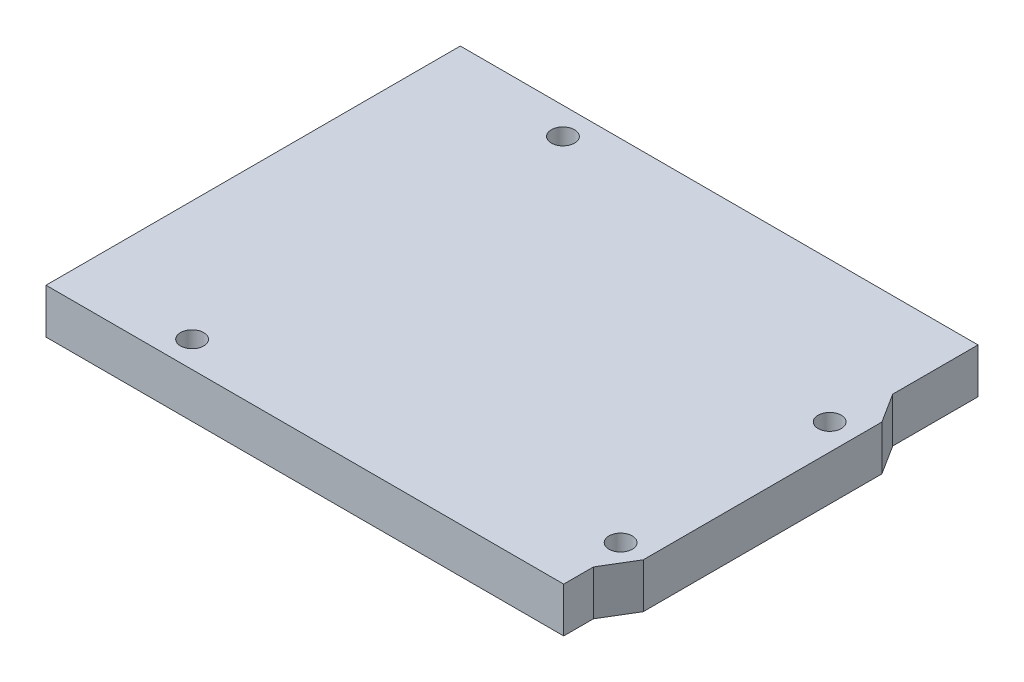
ISO-10303-21;
HEADER;
FILE_DESCRIPTION(('STEP AP214'),'2;1');
FILE_NAME('part.step','',(''),(''),'','','');
FILE_SCHEMA(('AUTOMOTIVE_DESIGN { 1 0 10303 214 1 1 1 1 }'));
ENDSEC;
DATA;
#1=APPLICATION_CONTEXT('core data for automotive mechanical design processes');
#2=APPLICATION_PROTOCOL_DEFINITION('international standard','automotive_design',2000,#1);
#3=PRODUCT_CONTEXT('',#1,'mechanical');
#4=PRODUCT('Part','Part','',(#3));
#5=PRODUCT_RELATED_PRODUCT_CATEGORY('part','',(#4));
#6=PRODUCT_DEFINITION_FORMATION('','',#4);
#7=PRODUCT_DEFINITION_CONTEXT('part definition',#1,'design');
#8=PRODUCT_DEFINITION('design','',#6,#7);
#9=PRODUCT_DEFINITION_SHAPE('','',#8);
#10=(LENGTH_UNIT() NAMED_UNIT(*) SI_UNIT(.MILLI.,.METRE.));
#11=(NAMED_UNIT(*) PLANE_ANGLE_UNIT() SI_UNIT($,.RADIAN.));
#12=(NAMED_UNIT(*) SI_UNIT($,.STERADIAN.) SOLID_ANGLE_UNIT());
#13=UNCERTAINTY_MEASURE_WITH_UNIT(LENGTH_MEASURE(1.E-05),#10,'distance_accuracy_value','');
#14=(GEOMETRIC_REPRESENTATION_CONTEXT(3) GLOBAL_UNCERTAINTY_ASSIGNED_CONTEXT((#13)) GLOBAL_UNIT_ASSIGNED_CONTEXT((#10,
#11,#12)) REPRESENTATION_CONTEXT('',''));
#15=CARTESIAN_POINT('',(0.,0.,0.));
#16=DIRECTION('',(0.,0.,1.));
#17=DIRECTION('',(1.,0.,0.));
#18=AXIS2_PLACEMENT_3D('',#15,#16,#17);
#19=CARTESIAN_POINT('',(0.,6.,0.));
#20=DIRECTION('',(0.,-1.,0.));
#21=DIRECTION('',(0.,0.,-1.));
#22=AXIS2_PLACEMENT_3D('',#19,#20,#21);
#23=PLANE('',#22);
#24=CARTESIAN_POINT('',(33.55,6.,19.05));
#25=DIRECTION('',(0.,1.,0.));
#26=DIRECTION('',(0.,0.,1.));
#27=AXIS2_PLACEMENT_3D('',#24,#25,#26);
#28=CIRCLE('',#27,1.55);
#29=CARTESIAN_POINT('',(33.55,6.,20.6));
#30=VERTEX_POINT('',#29);
#31=EDGE_CURVE('E188',#30,#30,#28,.T.);
#32=ORIENTED_EDGE('',*,*,#31,.F.);
#33=EDGE_LOOP('',(#32));
#34=FACE_BOUND('',#33,.T.);
#35=CARTESIAN_POINT('',(-17.25,6.,-24.05));
#36=DIRECTION('',(0.,1.,0.));
#37=DIRECTION('',(0.,0.,1.));
#38=AXIS2_PLACEMENT_3D('',#35,#36,#37);
#39=CIRCLE('',#38,1.55);
#40=CARTESIAN_POINT('',(-17.25,6.,-22.5));
#41=VERTEX_POINT('',#40);
#42=EDGE_CURVE('E134',#41,#41,#39,.T.);
#43=ORIENTED_EDGE('',*,*,#42,.F.);
#44=EDGE_LOOP('',(#43));
#45=FACE_BOUND('',#44,.T.);
#46=DIRECTION('',(0.,0.,-1.));
#47=VECTOR('',#46,1.);
#48=CARTESIAN_POINT('',(34.55,6.,-16.2706558546584));
#49=LINE('',#48,#47);
#50=CARTESIAN_POINT('',(34.55,6.,-16.2706558546584));
#51=VERTEX_POINT('',#50);
#52=CARTESIAN_POINT('',(34.55,6.,-27.65));
#53=VERTEX_POINT('',#52);
#54=EDGE_CURVE('E145',#51,#53,#49,.T.);
#55=ORIENTED_EDGE('',*,*,#54,.T.);
#56=DIRECTION('',(-1.,0.,0.));
#57=VECTOR('',#56,1.);
#58=CARTESIAN_POINT('',(-34.55,6.,-27.65));
#59=LINE('',#58,#57);
#60=CARTESIAN_POINT('',(-34.55,6.,-27.65));
#61=VERTEX_POINT('',#60);
#62=EDGE_CURVE('E93',#53,#61,#59,.T.);
#63=ORIENTED_EDGE('',*,*,#62,.T.);
#64=DIRECTION('',(0.,0.,1.));
#65=VECTOR('',#64,1.);
#66=CARTESIAN_POINT('',(-34.55,6.,27.65));
#67=LINE('',#66,#65);
#68=CARTESIAN_POINT('',(-34.55,6.,27.65));
#69=VERTEX_POINT('',#68);
#70=EDGE_CURVE('E160',#61,#69,#67,.T.);
#71=ORIENTED_EDGE('',*,*,#70,.T.);
#72=DIRECTION('',(1.,0.,0.));
#73=VECTOR('',#72,1.);
#74=CARTESIAN_POINT('',(-34.55,6.,27.65));
#75=LINE('',#74,#73);
#76=CARTESIAN_POINT('',(34.55,6.,27.65));
#77=VERTEX_POINT('',#76);
#78=EDGE_CURVE('E173',#69,#77,#75,.T.);
#79=ORIENTED_EDGE('',*,*,#78,.T.);
#80=DIRECTION('',(0.,0.,-1.));
#81=VECTOR('',#80,1.);
#82=CARTESIAN_POINT('',(34.55,6.,27.65));
#83=LINE('',#82,#81);
#84=CARTESIAN_POINT('',(34.55,6.,23.686069976501));
#85=VERTEX_POINT('',#84);
#86=EDGE_CURVE('E112',#77,#85,#83,.T.);
#87=ORIENTED_EDGE('',*,*,#86,.T.);
#88=DIRECTION('',(0.515427790775636,0.,-0.856933015174551));
#89=VECTOR('',#88,1.);
#90=CARTESIAN_POINT('',(37.05,6.,19.5296535467378));
#91=LINE('',#90,#89);
#92=CARTESIAN_POINT('',(37.05,6.,19.5296535467378));
#93=VERTEX_POINT('',#92);
#94=EDGE_CURVE('E106',#85,#93,#91,.T.);
#95=ORIENTED_EDGE('',*,*,#94,.T.);
#96=DIRECTION('',(0.,0.,-1.));
#97=VECTOR('',#96,1.);
#98=CARTESIAN_POINT('',(37.05,6.,-12.3214490528545));
#99=LINE('',#98,#97);
#100=CARTESIAN_POINT('',(37.05,6.,-12.3214490528545));
#101=VERTEX_POINT('',#100);
#102=EDGE_CURVE('E110',#93,#101,#99,.T.);
#103=ORIENTED_EDGE('',*,*,#102,.T.);
#104=DIRECTION('',(-0.534874279496176,0.,-0.844931657078516));
#105=VECTOR('',#104,1.);
#106=CARTESIAN_POINT('',(34.55,6.,-16.2706558546584));
#107=LINE('',#106,#105);
#108=EDGE_CURVE('E50',#101,#51,#107,.T.);
#109=ORIENTED_EDGE('',*,*,#108,.T.);
#110=EDGE_LOOP('',(#55,#63,#71,#79,#87,#95,#103,#109));
#111=FACE_BOUND('',#110,.T.);
#112=CARTESIAN_POINT('',(33.55,6.,-8.85));
#113=DIRECTION('',(0.,1.,0.));
#114=DIRECTION('',(0.,0.,1.));
#115=AXIS2_PLACEMENT_3D('',#112,#113,#114);
#116=CIRCLE('',#115,1.55);
#117=CARTESIAN_POINT('',(33.55,6.,-7.3));
#118=VERTEX_POINT('',#117);
#119=EDGE_CURVE('E182',#118,#118,#116,.T.);
#120=ORIENTED_EDGE('',*,*,#119,.F.);
#121=EDGE_LOOP('',(#120));
#122=FACE_BOUND('',#121,.T.);
#123=CARTESIAN_POINT('',(-18.55,6.,24.15));
#124=DIRECTION('',(0.,1.,0.));
#125=DIRECTION('',(0.,0.,1.));
#126=AXIS2_PLACEMENT_3D('',#123,#124,#125);
#127=CIRCLE('',#126,1.55);
#128=CARTESIAN_POINT('',(-18.55,6.,25.7));
#129=VERTEX_POINT('',#128);
#130=EDGE_CURVE('E194',#129,#129,#127,.T.);
#131=ORIENTED_EDGE('',*,*,#130,.F.);
#132=EDGE_LOOP('',(#131));
#133=FACE_BOUND('',#132,.T.);
#134=ADVANCED_FACE('F33',(#34,#45,#111,#122,#133),#23,.F.);
#135=CARTESIAN_POINT('',(0.,0.,0.));
#136=DIRECTION('',(0.,-1.,0.));
#137=DIRECTION('',(0.,0.,-1.));
#138=AXIS2_PLACEMENT_3D('',#135,#136,#137);
#139=PLANE('',#138);
#140=CARTESIAN_POINT('',(33.55,0.,19.05));
#141=DIRECTION('',(0.,1.,0.));
#142=DIRECTION('',(0.,0.,1.));
#143=AXIS2_PLACEMENT_3D('',#140,#141,#142);
#144=CIRCLE('',#143,1.55);
#145=CARTESIAN_POINT('',(33.55,0.,20.6));
#146=VERTEX_POINT('',#145);
#147=EDGE_CURVE('E191',#146,#146,#144,.T.);
#148=ORIENTED_EDGE('',*,*,#147,.T.);
#149=EDGE_LOOP('',(#148));
#150=FACE_BOUND('',#149,.T.);
#151=CARTESIAN_POINT('',(-17.25,0.,-24.05));
#152=DIRECTION('',(0.,1.,0.));
#153=DIRECTION('',(0.,0.,1.));
#154=AXIS2_PLACEMENT_3D('',#151,#152,#153);
#155=CIRCLE('',#154,1.55);
#156=CARTESIAN_POINT('',(-17.25,0.,-22.5));
#157=VERTEX_POINT('',#156);
#158=EDGE_CURVE('E179',#157,#157,#155,.T.);
#159=ORIENTED_EDGE('',*,*,#158,.T.);
#160=EDGE_LOOP('',(#159));
#161=FACE_BOUND('',#160,.T.);
#162=DIRECTION('',(0.,0.,-1.));
#163=VECTOR('',#162,1.);
#164=CARTESIAN_POINT('',(34.55,0.,-16.2706558546584));
#165=LINE('',#164,#163);
#166=CARTESIAN_POINT('',(34.55,0.,-16.2706558546584));
#167=VERTEX_POINT('',#166);
#168=CARTESIAN_POINT('',(34.55,0.,-27.65));
#169=VERTEX_POINT('',#168);
#170=EDGE_CURVE('E130',#167,#169,#165,.T.);
#171=ORIENTED_EDGE('',*,*,#170,.F.);
#172=DIRECTION('',(-0.534874279496176,0.,-0.844931657078516));
#173=VECTOR('',#172,1.);
#174=CARTESIAN_POINT('',(34.55,0.,-16.2706558546584));
#175=LINE('',#174,#173);
#176=CARTESIAN_POINT('',(37.05,0.,-12.3214490528545));
#177=VERTEX_POINT('',#176);
#178=EDGE_CURVE('E85',#177,#167,#175,.T.);
#179=ORIENTED_EDGE('',*,*,#178,.F.);
#180=DIRECTION('',(0.,0.,-1.));
#181=VECTOR('',#180,1.);
#182=CARTESIAN_POINT('',(37.05,0.,-12.3214490528545));
#183=LINE('',#182,#181);
#184=CARTESIAN_POINT('',(37.05,0.,19.5296535467378));
#185=VERTEX_POINT('',#184);
#186=EDGE_CURVE('E79',#185,#177,#183,.T.);
#187=ORIENTED_EDGE('',*,*,#186,.F.);
#188=DIRECTION('',(0.515427790775636,0.,-0.856933015174551));
#189=VECTOR('',#188,1.);
#190=CARTESIAN_POINT('',(37.05,0.,19.5296535467378));
#191=LINE('',#190,#189);
#192=CARTESIAN_POINT('',(34.55,0.,23.686069976501));
#193=VERTEX_POINT('',#192);
#194=EDGE_CURVE('E120',#193,#185,#191,.T.);
#195=ORIENTED_EDGE('',*,*,#194,.F.);
#196=DIRECTION('',(0.,0.,-1.));
#197=VECTOR('',#196,1.);
#198=CARTESIAN_POINT('',(34.55,0.,27.65));
#199=LINE('',#198,#197);
#200=CARTESIAN_POINT('',(34.55,0.,27.65));
#201=VERTEX_POINT('',#200);
#202=EDGE_CURVE('E140',#201,#193,#199,.T.);
#203=ORIENTED_EDGE('',*,*,#202,.F.);
#204=DIRECTION('',(1.,0.,0.));
#205=VECTOR('',#204,1.);
#206=CARTESIAN_POINT('',(-34.55,0.,27.65));
#207=LINE('',#206,#205);
#208=CARTESIAN_POINT('',(-34.55,0.,27.65));
#209=VERTEX_POINT('',#208);
#210=EDGE_CURVE('E138',#209,#201,#207,.T.);
#211=ORIENTED_EDGE('',*,*,#210,.F.);
#212=DIRECTION('',(0.,0.,1.));
#213=VECTOR('',#212,1.);
#214=CARTESIAN_POINT('',(-34.55,0.,27.65));
#215=LINE('',#214,#213);
#216=CARTESIAN_POINT('',(-34.55,0.,-27.65));
#217=VERTEX_POINT('',#216);
#218=EDGE_CURVE('E136',#217,#209,#215,.T.);
#219=ORIENTED_EDGE('',*,*,#218,.F.);
#220=DIRECTION('',(-1.,0.,0.));
#221=VECTOR('',#220,1.);
#222=CARTESIAN_POINT('',(-34.55,0.,-27.65));
#223=LINE('',#222,#221);
#224=EDGE_CURVE('E133',#169,#217,#223,.T.);
#225=ORIENTED_EDGE('',*,*,#224,.F.);
#226=EDGE_LOOP('',(#171,#179,#187,#195,#203,#211,#219,#225));
#227=FACE_BOUND('',#226,.T.);
#228=CARTESIAN_POINT('',(33.55,0.,-8.85));
#229=DIRECTION('',(0.,1.,0.));
#230=DIRECTION('',(0.,0.,1.));
#231=AXIS2_PLACEMENT_3D('',#228,#229,#230);
#232=CIRCLE('',#231,1.55);
#233=CARTESIAN_POINT('',(33.55,0.,-7.3));
#234=VERTEX_POINT('',#233);
#235=EDGE_CURVE('E185',#234,#234,#232,.T.);
#236=ORIENTED_EDGE('',*,*,#235,.T.);
#237=EDGE_LOOP('',(#236));
#238=FACE_BOUND('',#237,.T.);
#239=CARTESIAN_POINT('',(-18.55,0.,24.15));
#240=DIRECTION('',(0.,1.,0.));
#241=DIRECTION('',(0.,0.,1.));
#242=AXIS2_PLACEMENT_3D('',#239,#240,#241);
#243=CIRCLE('',#242,1.55);
#244=CARTESIAN_POINT('',(-18.55,0.,25.7));
#245=VERTEX_POINT('',#244);
#246=EDGE_CURVE('E197',#245,#245,#243,.T.);
#247=ORIENTED_EDGE('',*,*,#246,.T.);
#248=EDGE_LOOP('',(#247));
#249=FACE_BOUND('',#248,.T.);
#250=ADVANCED_FACE('F164',(#150,#161,#227,#238,#249),#139,.T.);
#251=CARTESIAN_POINT('',(34.55,6.,-16.2706558546584));
#252=DIRECTION('',(-1.,0.,0.));
#253=DIRECTION('',(0.,0.,1.));
#254=AXIS2_PLACEMENT_3D('',#251,#252,#253);
#255=PLANE('',#254);
#256=ORIENTED_EDGE('',*,*,#170,.T.);
#257=DIRECTION('',(0.,-1.,0.));
#258=VECTOR('',#257,1.);
#259=CARTESIAN_POINT('',(34.55,6.,-27.65));
#260=LINE('',#259,#258);
#261=EDGE_CURVE('E11',#53,#169,#260,.T.);
#262=ORIENTED_EDGE('',*,*,#261,.F.);
#263=ORIENTED_EDGE('',*,*,#54,.F.);
#264=DIRECTION('',(0.,-1.,0.));
#265=VECTOR('',#264,1.);
#266=CARTESIAN_POINT('',(34.55,6.,-16.2706558546584));
#267=LINE('',#266,#265);
#268=EDGE_CURVE('E126',#51,#167,#267,.T.);
#269=ORIENTED_EDGE('',*,*,#268,.T.);
#270=EDGE_LOOP('',(#256,#262,#263,#269));
#271=FACE_BOUND('',#270,.T.);
#272=ADVANCED_FACE('F35',(#271),#255,.F.);
#273=CARTESIAN_POINT('',(-34.55,6.,-27.65));
#274=DIRECTION('',(0.,0.,1.));
#275=DIRECTION('',(1.,0.,0.));
#276=AXIS2_PLACEMENT_3D('',#273,#274,#275);
#277=PLANE('',#276);
#278=ORIENTED_EDGE('',*,*,#224,.T.);
#279=DIRECTION('',(0.,-1.,0.));
#280=VECTOR('',#279,1.);
#281=CARTESIAN_POINT('',(-34.55,6.,-27.65));
#282=LINE('',#281,#280);
#283=EDGE_CURVE('E42',#61,#217,#282,.T.);
#284=ORIENTED_EDGE('',*,*,#283,.F.);
#285=ORIENTED_EDGE('',*,*,#62,.F.);
#286=ORIENTED_EDGE('',*,*,#261,.T.);
#287=EDGE_LOOP('',(#278,#284,#285,#286));
#288=FACE_BOUND('',#287,.T.);
#289=ADVANCED_FACE('F232',(#288),#277,.F.);
#290=CARTESIAN_POINT('',(-34.55,6.,27.65));
#291=DIRECTION('',(1.,0.,0.));
#292=DIRECTION('',(0.,0.,-1.));
#293=AXIS2_PLACEMENT_3D('',#290,#291,#292);
#294=PLANE('',#293);
#295=ORIENTED_EDGE('',*,*,#218,.T.);
#296=DIRECTION('',(0.,-1.,0.));
#297=VECTOR('',#296,1.);
#298=CARTESIAN_POINT('',(-34.55,6.,27.65));
#299=LINE('',#298,#297);
#300=EDGE_CURVE('E152',#69,#209,#299,.T.);
#301=ORIENTED_EDGE('',*,*,#300,.F.);
#302=ORIENTED_EDGE('',*,*,#70,.F.);
#303=ORIENTED_EDGE('',*,*,#283,.T.);
#304=EDGE_LOOP('',(#295,#301,#302,#303));
#305=FACE_BOUND('',#304,.T.);
#306=ADVANCED_FACE('F158',(#305),#294,.F.);
#307=CARTESIAN_POINT('',(-34.55,6.,27.65));
#308=DIRECTION('',(0.,0.,-1.));
#309=DIRECTION('',(-1.,0.,0.));
#310=AXIS2_PLACEMENT_3D('',#307,#308,#309);
#311=PLANE('',#310);
#312=ORIENTED_EDGE('',*,*,#210,.T.);
#313=DIRECTION('',(0.,-1.,0.));
#314=VECTOR('',#313,1.);
#315=CARTESIAN_POINT('',(34.55,6.,27.65));
#316=LINE('',#315,#314);
#317=EDGE_CURVE('E149',#77,#201,#316,.T.);
#318=ORIENTED_EDGE('',*,*,#317,.F.);
#319=ORIENTED_EDGE('',*,*,#78,.F.);
#320=ORIENTED_EDGE('',*,*,#300,.T.);
#321=EDGE_LOOP('',(#312,#318,#319,#320));
#322=FACE_BOUND('',#321,.T.);
#323=ADVANCED_FACE('F169',(#322),#311,.F.);
#324=CARTESIAN_POINT('',(34.55,6.,27.65));
#325=DIRECTION('',(-1.,0.,0.));
#326=DIRECTION('',(0.,0.,1.));
#327=AXIS2_PLACEMENT_3D('',#324,#325,#326);
#328=PLANE('',#327);
#329=ORIENTED_EDGE('',*,*,#202,.T.);
#330=DIRECTION('',(0.,-1.,0.));
#331=VECTOR('',#330,1.);
#332=CARTESIAN_POINT('',(34.55,6.,23.686069976501));
#333=LINE('',#332,#331);
#334=EDGE_CURVE('E121',#85,#193,#333,.T.);
#335=ORIENTED_EDGE('',*,*,#334,.F.);
#336=ORIENTED_EDGE('',*,*,#86,.F.);
#337=ORIENTED_EDGE('',*,*,#317,.T.);
#338=EDGE_LOOP('',(#329,#335,#336,#337));
#339=FACE_BOUND('',#338,.T.);
#340=ADVANCED_FACE('F172',(#339),#328,.F.);
#341=CARTESIAN_POINT('',(37.05,6.,19.5296535467378));
#342=DIRECTION('',(-0.856933015174551,0.,-0.515427790775636));
#343=DIRECTION('',(-0.515427790775636,0.,0.856933015174551));
#344=AXIS2_PLACEMENT_3D('',#341,#342,#343);
#345=PLANE('',#344);
#346=ORIENTED_EDGE('',*,*,#194,.T.);
#347=DIRECTION('',(0.,-1.,0.));
#348=VECTOR('',#347,1.);
#349=CARTESIAN_POINT('',(37.05,6.,19.5296535467378));
#350=LINE('',#349,#348);
#351=EDGE_CURVE('E117',#93,#185,#350,.T.);
#352=ORIENTED_EDGE('',*,*,#351,.F.);
#353=ORIENTED_EDGE('',*,*,#94,.F.);
#354=ORIENTED_EDGE('',*,*,#334,.T.);
#355=EDGE_LOOP('',(#346,#352,#353,#354));
#356=FACE_BOUND('',#355,.T.);
#357=ADVANCED_FACE('F118',(#356),#345,.F.);
#358=CARTESIAN_POINT('',(37.05,6.,-12.3214490528545));
#359=DIRECTION('',(-1.,0.,0.));
#360=DIRECTION('',(0.,0.,1.));
#361=AXIS2_PLACEMENT_3D('',#358,#359,#360);
#362=PLANE('',#361);
#363=ORIENTED_EDGE('',*,*,#186,.T.);
#364=DIRECTION('',(0.,-1.,0.));
#365=VECTOR('',#364,1.);
#366=CARTESIAN_POINT('',(37.05,6.,-12.3214490528545));
#367=LINE('',#366,#365);
#368=EDGE_CURVE('E122',#101,#177,#367,.T.);
#369=ORIENTED_EDGE('',*,*,#368,.F.);
#370=ORIENTED_EDGE('',*,*,#102,.F.);
#371=ORIENTED_EDGE('',*,*,#351,.T.);
#372=EDGE_LOOP('',(#363,#369,#370,#371));
#373=FACE_BOUND('',#372,.T.);
#374=ADVANCED_FACE('F124',(#373),#362,.F.);
#375=CARTESIAN_POINT('',(34.55,6.,-16.2706558546584));
#376=DIRECTION('',(-0.844931657078516,0.,0.534874279496176));
#377=DIRECTION('',(0.534874279496176,0.,0.844931657078516));
#378=AXIS2_PLACEMENT_3D('',#375,#376,#377);
#379=PLANE('',#378);
#380=ORIENTED_EDGE('',*,*,#178,.T.);
#381=ORIENTED_EDGE('',*,*,#268,.F.);
#382=ORIENTED_EDGE('',*,*,#108,.F.);
#383=ORIENTED_EDGE('',*,*,#368,.T.);
#384=EDGE_LOOP('',(#380,#381,#382,#383));
#385=FACE_BOUND('',#384,.T.);
#386=ADVANCED_FACE('F220',(#385),#379,.F.);
#387=CARTESIAN_POINT('',(-17.25,6.,-24.05));
#388=DIRECTION('',(0.,-1.,0.));
#389=DIRECTION('',(0.,0.,-1.));
#390=AXIS2_PLACEMENT_3D('',#387,#388,#389);
#391=CYLINDRICAL_SURFACE('',#390,1.55);
#392=ORIENTED_EDGE('',*,*,#42,.T.);
#393=EDGE_LOOP('',(#392));
#394=FACE_BOUND('',#393,.T.);
#395=ORIENTED_EDGE('',*,*,#158,.F.);
#396=EDGE_LOOP('',(#395));
#397=FACE_BOUND('',#396,.T.);
#398=ADVANCED_FACE('F217',(#394,#397),#391,.F.);
#399=CARTESIAN_POINT('',(33.55,6.,-8.85));
#400=DIRECTION('',(0.,-1.,0.));
#401=DIRECTION('',(0.,0.,-1.));
#402=AXIS2_PLACEMENT_3D('',#399,#400,#401);
#403=CYLINDRICAL_SURFACE('',#402,1.55);
#404=ORIENTED_EDGE('',*,*,#119,.T.);
#405=EDGE_LOOP('',(#404));
#406=FACE_BOUND('',#405,.T.);
#407=ORIENTED_EDGE('',*,*,#235,.F.);
#408=EDGE_LOOP('',(#407));
#409=FACE_BOUND('',#408,.T.);
#410=ADVANCED_FACE('F296',(#406,#409),#403,.F.);
#411=CARTESIAN_POINT('',(33.55,6.,19.05));
#412=DIRECTION('',(0.,-1.,0.));
#413=DIRECTION('',(0.,0.,-1.));
#414=AXIS2_PLACEMENT_3D('',#411,#412,#413);
#415=CYLINDRICAL_SURFACE('',#414,1.55);
#416=ORIENTED_EDGE('',*,*,#31,.T.);
#417=EDGE_LOOP('',(#416));
#418=FACE_BOUND('',#417,.T.);
#419=ORIENTED_EDGE('',*,*,#147,.F.);
#420=EDGE_LOOP('',(#419));
#421=FACE_BOUND('',#420,.T.);
#422=ADVANCED_FACE('F304',(#418,#421),#415,.F.);
#423=CARTESIAN_POINT('',(-18.55,6.,24.15));
#424=DIRECTION('',(0.,-1.,0.));
#425=DIRECTION('',(0.,0.,-1.));
#426=AXIS2_PLACEMENT_3D('',#423,#424,#425);
#427=CYLINDRICAL_SURFACE('',#426,1.55);
#428=ORIENTED_EDGE('',*,*,#130,.T.);
#429=EDGE_LOOP('',(#428));
#430=FACE_BOUND('',#429,.T.);
#431=ORIENTED_EDGE('',*,*,#246,.F.);
#432=EDGE_LOOP('',(#431));
#433=FACE_BOUND('',#432,.T.);
#434=ADVANCED_FACE('F203',(#430,#433),#427,.F.);
#435=CLOSED_SHELL('',(#134,#250,#272,#289,#306,#323,#340,#357,#374,#386,#398,#410,#422,#434));
#436=MANIFOLD_SOLID_BREP('B2',#435);
#437=ADVANCED_BREP_SHAPE_REPRESENTATION('',(#18,#436),#14);
#438=SHAPE_DEFINITION_REPRESENTATION(#9,#437);
ENDSEC;
END-ISO-10303-21;
